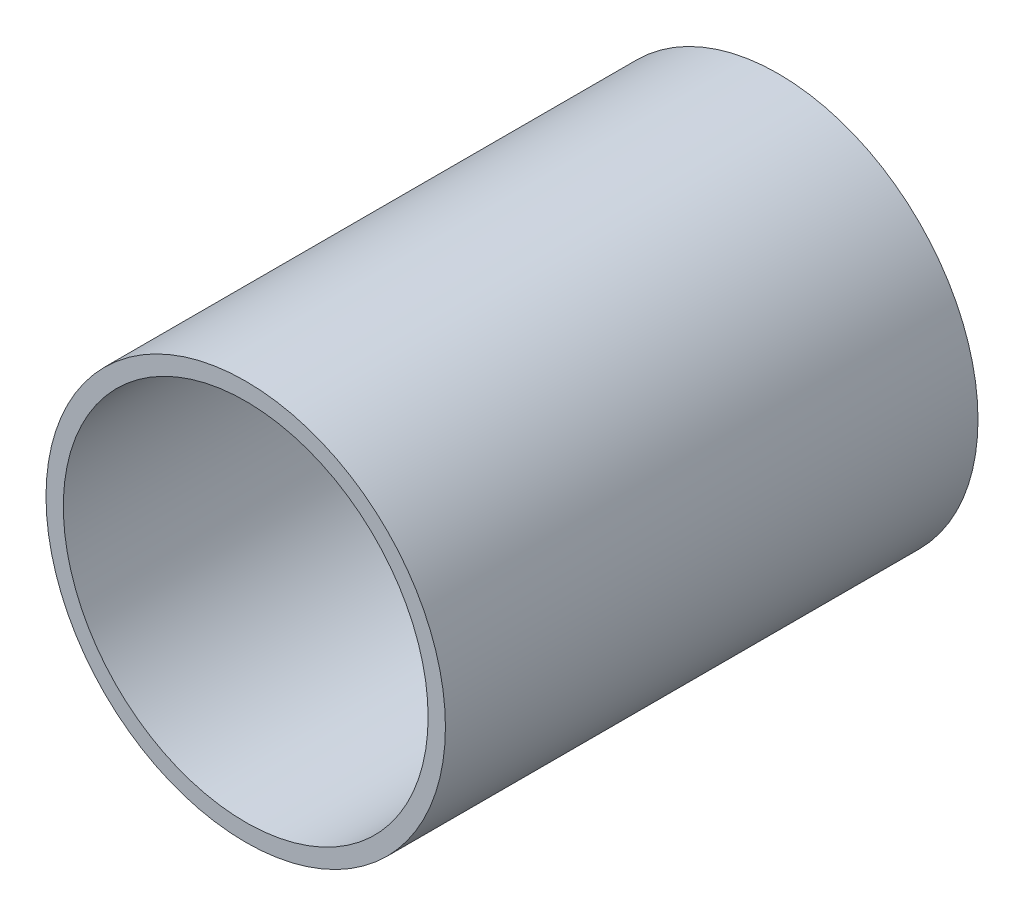
ISO-10303-21;
HEADER;
FILE_DESCRIPTION(('STEP AP214'),'2;1');
FILE_NAME('part.step','',(''),(''),'','','');
FILE_SCHEMA(('AUTOMOTIVE_DESIGN { 1 0 10303 214 1 1 1 1 }'));
ENDSEC;
DATA;
#1=APPLICATION_CONTEXT('core data for automotive mechanical design processes');
#2=APPLICATION_PROTOCOL_DEFINITION('international standard','automotive_design',2000,#1);
#3=PRODUCT_CONTEXT('',#1,'mechanical');
#4=PRODUCT('Part','Part','',(#3));
#5=PRODUCT_RELATED_PRODUCT_CATEGORY('part','',(#4));
#6=PRODUCT_DEFINITION_FORMATION('','',#4);
#7=PRODUCT_DEFINITION_CONTEXT('part definition',#1,'design');
#8=PRODUCT_DEFINITION('design','',#6,#7);
#9=PRODUCT_DEFINITION_SHAPE('','',#8);
#10=(LENGTH_UNIT() NAMED_UNIT(*) SI_UNIT(.MILLI.,.METRE.));
#11=(NAMED_UNIT(*) PLANE_ANGLE_UNIT() SI_UNIT($,.RADIAN.));
#12=(NAMED_UNIT(*) SI_UNIT($,.STERADIAN.) SOLID_ANGLE_UNIT());
#13=UNCERTAINTY_MEASURE_WITH_UNIT(LENGTH_MEASURE(1.E-05),#10,'distance_accuracy_value','');
#14=(GEOMETRIC_REPRESENTATION_CONTEXT(3) GLOBAL_UNCERTAINTY_ASSIGNED_CONTEXT((#13)) GLOBAL_UNIT_ASSIGNED_CONTEXT((#10,
#11,#12)) REPRESENTATION_CONTEXT('',''));
#15=CARTESIAN_POINT('',(0.,0.,0.));
#16=DIRECTION('',(0.,0.,1.));
#17=DIRECTION('',(1.,0.,0.));
#18=AXIS2_PLACEMENT_3D('',#15,#16,#17);
#19=CARTESIAN_POINT('',(0.,0.,50.8));
#20=DIRECTION('',(0.,0.,1.));
#21=DIRECTION('',(1.,0.,0.));
#22=AXIS2_PLACEMENT_3D('',#19,#20,#21);
#23=PLANE('',#22);
#24=CARTESIAN_POINT('',(0.,0.,50.8));
#25=DIRECTION('',(0.,0.,1.));
#26=DIRECTION('',(1.,0.,0.));
#27=AXIS2_PLACEMENT_3D('',#24,#25,#26);
#28=CIRCLE('',#27,19.05);
#29=CARTESIAN_POINT('',(19.05,0.,50.8));
#30=VERTEX_POINT('',#29);
#31=EDGE_CURVE('E10',#30,#30,#28,.T.);
#32=ORIENTED_EDGE('',*,*,#31,.T.);
#33=EDGE_LOOP('',(#32));
#34=FACE_BOUND('',#33,.T.);
#35=CARTESIAN_POINT('',(0.,0.,50.8));
#36=DIRECTION('',(0.,0.,1.));
#37=DIRECTION('',(1.,0.,0.));
#38=AXIS2_PLACEMENT_3D('',#35,#36,#37);
#39=CIRCLE('',#38,17.399);
#40=CARTESIAN_POINT('',(17.399,0.,50.8));
#41=VERTEX_POINT('',#40);
#42=EDGE_CURVE('E42',#41,#41,#39,.T.);
#43=ORIENTED_EDGE('',*,*,#42,.F.);
#44=EDGE_LOOP('',(#43));
#45=FACE_BOUND('',#44,.T.);
#46=ADVANCED_FACE('F31',(#34,#45),#23,.T.);
#47=CARTESIAN_POINT('',(0.,0.,0.));
#48=DIRECTION('',(0.,0.,1.));
#49=DIRECTION('',(1.,0.,0.));
#50=AXIS2_PLACEMENT_3D('',#47,#48,#49);
#51=PLANE('',#50);
#52=CARTESIAN_POINT('',(0.,0.,0.));
#53=DIRECTION('',(0.,0.,1.));
#54=DIRECTION('',(1.,0.,0.));
#55=AXIS2_PLACEMENT_3D('',#52,#53,#54);
#56=CIRCLE('',#55,19.05);
#57=CARTESIAN_POINT('',(19.05,0.,0.));
#58=VERTEX_POINT('',#57);
#59=EDGE_CURVE('E35',#58,#58,#56,.T.);
#60=ORIENTED_EDGE('',*,*,#59,.F.);
#61=EDGE_LOOP('',(#60));
#62=FACE_BOUND('',#61,.T.);
#63=CARTESIAN_POINT('',(0.,0.,0.));
#64=DIRECTION('',(0.,0.,1.));
#65=DIRECTION('',(1.,0.,0.));
#66=AXIS2_PLACEMENT_3D('',#63,#64,#65);
#67=CIRCLE('',#66,17.399);
#68=CARTESIAN_POINT('',(17.399,0.,0.));
#69=VERTEX_POINT('',#68);
#70=EDGE_CURVE('E44',#69,#69,#67,.T.);
#71=ORIENTED_EDGE('',*,*,#70,.T.);
#72=EDGE_LOOP('',(#71));
#73=FACE_BOUND('',#72,.T.);
#74=ADVANCED_FACE('F54',(#62,#73),#51,.F.);
#75=CARTESIAN_POINT('',(0.,0.,50.8));
#76=DIRECTION('',(0.,0.,-1.));
#77=DIRECTION('',(-1.,0.,0.));
#78=AXIS2_PLACEMENT_3D('',#75,#76,#77);
#79=CYLINDRICAL_SURFACE('',#78,19.05);
#80=ORIENTED_EDGE('',*,*,#31,.F.);
#81=EDGE_LOOP('',(#80));
#82=FACE_BOUND('',#81,.T.);
#83=ORIENTED_EDGE('',*,*,#59,.T.);
#84=EDGE_LOOP('',(#83));
#85=FACE_BOUND('',#84,.T.);
#86=ADVANCED_FACE('F33',(#82,#85),#79,.T.);
#87=CARTESIAN_POINT('',(0.,0.,50.8));
#88=DIRECTION('',(0.,0.,-1.));
#89=DIRECTION('',(-1.,0.,0.));
#90=AXIS2_PLACEMENT_3D('',#87,#88,#89);
#91=CYLINDRICAL_SURFACE('',#90,17.399);
#92=ORIENTED_EDGE('',*,*,#42,.T.);
#93=EDGE_LOOP('',(#92));
#94=FACE_BOUND('',#93,.T.);
#95=ORIENTED_EDGE('',*,*,#70,.F.);
#96=EDGE_LOOP('',(#95));
#97=FACE_BOUND('',#96,.T.);
#98=ADVANCED_FACE('F50',(#94,#97),#91,.F.);
#99=CLOSED_SHELL('',(#46,#74,#86,#98));
#100=MANIFOLD_SOLID_BREP('B2',#99);
#101=ADVANCED_BREP_SHAPE_REPRESENTATION('',(#18,#100),#14);
#102=SHAPE_DEFINITION_REPRESENTATION(#9,#101);
ENDSEC;
END-ISO-10303-21;
